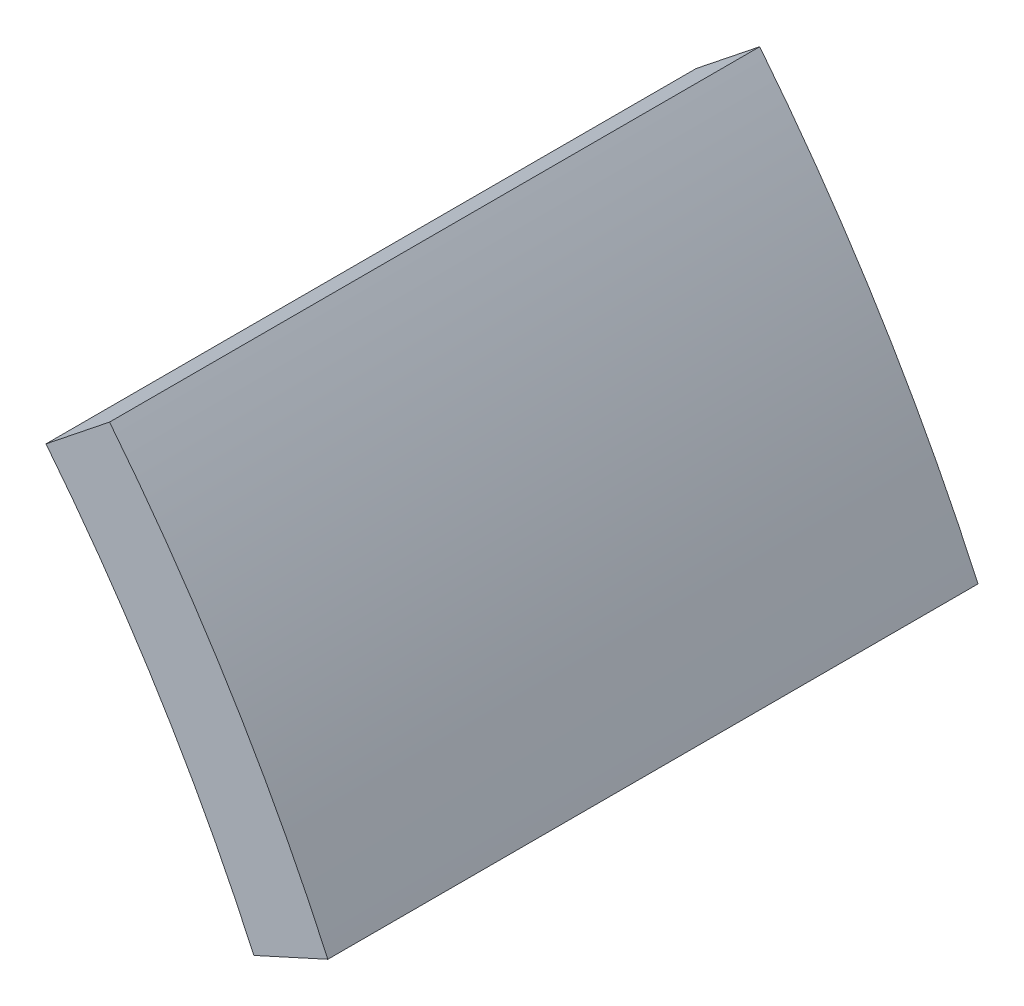
ISO-10303-21;
HEADER;
FILE_DESCRIPTION(('STEP AP214'),'2;1');
FILE_NAME('part.step','',(''),(''),'','','');
FILE_SCHEMA(('AUTOMOTIVE_DESIGN { 1 0 10303 214 1 1 1 1 }'));
ENDSEC;
DATA;
#1=APPLICATION_CONTEXT('core data for automotive mechanical design processes');
#2=APPLICATION_PROTOCOL_DEFINITION('international standard','automotive_design',2000,#1);
#3=PRODUCT_CONTEXT('',#1,'mechanical');
#4=PRODUCT('Part','Part','',(#3));
#5=PRODUCT_RELATED_PRODUCT_CATEGORY('part','',(#4));
#6=PRODUCT_DEFINITION_FORMATION('','',#4);
#7=PRODUCT_DEFINITION_CONTEXT('part definition',#1,'design');
#8=PRODUCT_DEFINITION('design','',#6,#7);
#9=PRODUCT_DEFINITION_SHAPE('','',#8);
#10=(LENGTH_UNIT() NAMED_UNIT(*) SI_UNIT(.MILLI.,.METRE.));
#11=(NAMED_UNIT(*) PLANE_ANGLE_UNIT() SI_UNIT($,.RADIAN.));
#12=(NAMED_UNIT(*) SI_UNIT($,.STERADIAN.) SOLID_ANGLE_UNIT());
#13=UNCERTAINTY_MEASURE_WITH_UNIT(LENGTH_MEASURE(1.E-05),#10,'distance_accuracy_value','');
#14=(GEOMETRIC_REPRESENTATION_CONTEXT(3) GLOBAL_UNCERTAINTY_ASSIGNED_CONTEXT((#13)) GLOBAL_UNIT_ASSIGNED_CONTEXT((#10,
#11,#12)) REPRESENTATION_CONTEXT('',''));
#15=CARTESIAN_POINT('',(0.,0.,0.));
#16=DIRECTION('',(0.,0.,1.));
#17=DIRECTION('',(1.,0.,0.));
#18=AXIS2_PLACEMENT_3D('',#15,#16,#17);
#19=CARTESIAN_POINT('',(-75.4909479660999,3.28970207192843,10.));
#20=DIRECTION('',(0.623312391087836,-0.781972929912772,0.));
#21=DIRECTION('',(0.,0.,-1.));
#22=AXIS2_PLACEMENT_3D('',#19,#20,#21);
#23=PLANE('',#22);
#24=DIRECTION('',(-0.781972929912772,-0.623312391087836,0.));
#25=VECTOR('',#24,1.);
#26=CARTESIAN_POINT('',(-75.4909479660999,3.28970207192842,-18.));
#27=LINE('',#26,#25);
#28=CARTESIAN_POINT('',(-2.27917339957138,61.6469731681758,-18.));
#29=VERTEX_POINT('',#28);
#30=CARTESIAN_POINT('',(-5.60255835169301,58.9978955060587,-18.));
#31=VERTEX_POINT('',#30);
#32=EDGE_CURVE('E11',#29,#31,#27,.T.);
#33=ORIENTED_EDGE('',*,*,#32,.T.);
#34=DIRECTION('',(0.,0.,-1.));
#35=VECTOR('',#34,1.);
#36=CARTESIAN_POINT('',(-5.60255835169301,58.9978955060587,10.));
#37=LINE('',#36,#35);
#38=CARTESIAN_POINT('',(-5.60255835169301,58.9978955060587,16.));
#39=VERTEX_POINT('',#38);
#40=EDGE_CURVE('E37',#39,#31,#37,.T.);
#41=ORIENTED_EDGE('',*,*,#40,.F.);
#42=DIRECTION('',(-0.781972929912772,-0.623312391087836,0.));
#43=VECTOR('',#42,1.);
#44=CARTESIAN_POINT('',(-75.4909479660999,3.28970207192842,16.));
#45=LINE('',#44,#43);
#46=CARTESIAN_POINT('',(-2.27917339957138,61.6469731681758,16.));
#47=VERTEX_POINT('',#46);
#48=EDGE_CURVE('E95',#47,#39,#45,.T.);
#49=ORIENTED_EDGE('',*,*,#48,.F.);
#50=DIRECTION('',(0.,0.,-1.));
#51=VECTOR('',#50,1.);
#52=CARTESIAN_POINT('',(-2.27917339957138,61.6469731681758,10.));
#53=LINE('',#52,#51);
#54=EDGE_CURVE('E28',#47,#29,#53,.T.);
#55=ORIENTED_EDGE('',*,*,#54,.T.);
#56=EDGE_LOOP('',(#33,#41,#49,#55));
#57=FACE_BOUND('',#56,.T.);
#58=ADVANCED_FACE('F17',(#57),#23,.F.);
#59=CARTESIAN_POINT('',(-71.8747641621128,6.17217036174182,10.));
#60=DIRECTION('',(0.,0.,-1.));
#61=DIRECTION('',(-1.,0.,0.));
#62=AXIS2_PLACEMENT_3D('',#59,#60,#61);
#63=CYLINDRICAL_SURFACE('',#62,88.9999999999993);
#64=CARTESIAN_POINT('',(-71.8747641621128,6.17217036174182,-18.));
#65=DIRECTION('',(0.,0.,1.));
#66=DIRECTION('',(-1.,0.,0.));
#67=AXIS2_PLACEMENT_3D('',#64,#65,#66);
#68=CIRCLE('',#67,88.9999999999993);
#69=CARTESIAN_POINT('',(9.13694292671469,43.0246236661543,-18.));
#70=VERTEX_POINT('',#69);
#71=EDGE_CURVE('E80',#70,#29,#68,.T.);
#72=ORIENTED_EDGE('',*,*,#71,.T.);
#73=ORIENTED_EDGE('',*,*,#54,.F.);
#74=CARTESIAN_POINT('',(-71.8747641621128,6.17217036174182,16.));
#75=DIRECTION('',(0.,0.,1.));
#76=DIRECTION('',(-1.,0.,0.));
#77=AXIS2_PLACEMENT_3D('',#74,#75,#76);
#78=CIRCLE('',#77,88.9999999999993);
#79=CARTESIAN_POINT('',(9.13694292671469,43.0246236661543,16.));
#80=VERTEX_POINT('',#79);
#81=EDGE_CURVE('E54',#80,#47,#78,.T.);
#82=ORIENTED_EDGE('',*,*,#81,.F.);
#83=DIRECTION('',(0.,0.,-1.));
#84=VECTOR('',#83,1.);
#85=CARTESIAN_POINT('',(9.13694292671469,43.0246236661543,10.));
#86=LINE('',#85,#84);
#87=EDGE_CURVE('E59',#80,#70,#86,.T.);
#88=ORIENTED_EDGE('',*,*,#87,.T.);
#89=EDGE_LOOP('',(#72,#73,#82,#88));
#90=FACE_BOUND('',#89,.T.);
#91=ADVANCED_FACE('F115',(#90),#63,.T.);
#92=CARTESIAN_POINT('',(-67.5425483112644,8.14290753118782,10.));
#93=DIRECTION('',(-0.414072509041721,0.910243899872937,0.));
#94=DIRECTION('',(0.,0.,1.));
#95=AXIS2_PLACEMENT_3D('',#92,#93,#94);
#96=PLANE('',#95);
#97=DIRECTION('',(0.910243899872937,0.414072509041721,0.));
#98=VECTOR('',#97,1.);
#99=CARTESIAN_POINT('',(-67.5425483112644,8.14290753118782,-18.));
#100=LINE('',#99,#98);
#101=CARTESIAN_POINT('',(5.26840635226366,41.2648155027311,-18.));
#102=VERTEX_POINT('',#101);
#103=EDGE_CURVE('E71',#102,#70,#100,.T.);
#104=ORIENTED_EDGE('',*,*,#103,.T.);
#105=ORIENTED_EDGE('',*,*,#87,.F.);
#106=DIRECTION('',(0.910243899872937,0.414072509041721,0.));
#107=VECTOR('',#106,1.);
#108=CARTESIAN_POINT('',(-67.5425483112644,8.14290753118782,16.));
#109=LINE('',#108,#107);
#110=CARTESIAN_POINT('',(5.26840635226366,41.2648155027311,16.));
#111=VERTEX_POINT('',#110);
#112=EDGE_CURVE('E65',#111,#80,#109,.T.);
#113=ORIENTED_EDGE('',*,*,#112,.F.);
#114=DIRECTION('',(0.,0.,-1.));
#115=VECTOR('',#114,1.);
#116=CARTESIAN_POINT('',(5.26840635226366,41.2648155027311,10.));
#117=LINE('',#116,#115);
#118=EDGE_CURVE('E68',#111,#102,#117,.T.);
#119=ORIENTED_EDGE('',*,*,#118,.T.);
#120=EDGE_LOOP('',(#104,#105,#113,#119));
#121=FACE_BOUND('',#120,.T.);
#122=ADVANCED_FACE('F70',(#121),#96,.F.);
#123=CARTESIAN_POINT('',(-71.8747641621128,6.17217036174182,10.));
#124=DIRECTION('',(0.,0.,-1.));
#125=DIRECTION('',(-1.,0.,0.));
#126=AXIS2_PLACEMENT_3D('',#123,#124,#125);
#127=CYLINDRICAL_SURFACE('',#126,84.7500000000091);
#128=CARTESIAN_POINT('',(-71.8747641621128,6.17217036174182,-18.));
#129=DIRECTION('',(0.,0.,1.));
#130=DIRECTION('',(-1.,0.,0.));
#131=AXIS2_PLACEMENT_3D('',#128,#129,#130);
#132=CIRCLE('',#131,84.7500000000091);
#133=EDGE_CURVE('E21',#102,#31,#132,.T.);
#134=ORIENTED_EDGE('',*,*,#133,.F.);
#135=ORIENTED_EDGE('',*,*,#118,.F.);
#136=CARTESIAN_POINT('',(-71.8747641621128,6.17217036174182,16.));
#137=DIRECTION('',(0.,0.,1.));
#138=DIRECTION('',(-1.,0.,0.));
#139=AXIS2_PLACEMENT_3D('',#136,#137,#138);
#140=CIRCLE('',#139,84.7500000000091);
#141=EDGE_CURVE('E74',#111,#39,#140,.T.);
#142=ORIENTED_EDGE('',*,*,#141,.T.);
#143=ORIENTED_EDGE('',*,*,#40,.T.);
#144=EDGE_LOOP('',(#134,#135,#142,#143));
#145=FACE_BOUND('',#144,.T.);
#146=ADVANCED_FACE('F19',(#145),#127,.F.);
#147=CARTESIAN_POINT('',(-51.833752333337,-26.38929492376,-18.));
#148=DIRECTION('',(0.,0.,1.));
#149=DIRECTION('',(1.,0.,0.));
#150=AXIS2_PLACEMENT_3D('',#147,#148,#149);
#151=PLANE('',#150);
#152=ORIENTED_EDGE('',*,*,#133,.T.);
#153=ORIENTED_EDGE('',*,*,#32,.F.);
#154=ORIENTED_EDGE('',*,*,#71,.F.);
#155=ORIENTED_EDGE('',*,*,#103,.F.);
#156=EDGE_LOOP('',(#152,#153,#154,#155));
#157=FACE_BOUND('',#156,.T.);
#158=ADVANCED_FACE('F78',(#157),#151,.F.);
#159=CARTESIAN_POINT('',(-51.833752333337,-26.38929492376,16.));
#160=DIRECTION('',(0.,0.,1.));
#161=DIRECTION('',(1.,0.,0.));
#162=AXIS2_PLACEMENT_3D('',#159,#160,#161);
#163=PLANE('',#162);
#164=ORIENTED_EDGE('',*,*,#141,.F.);
#165=ORIENTED_EDGE('',*,*,#112,.T.);
#166=ORIENTED_EDGE('',*,*,#81,.T.);
#167=ORIENTED_EDGE('',*,*,#48,.T.);
#168=EDGE_LOOP('',(#164,#165,#166,#167));
#169=FACE_BOUND('',#168,.T.);
#170=ADVANCED_FACE('F113',(#169),#163,.T.);
#171=CLOSED_SHELL('',(#58,#91,#122,#146,#158,#170));
#172=MANIFOLD_SOLID_BREP('B1',#171);
#173=ADVANCED_BREP_SHAPE_REPRESENTATION('',(#18,#172),#14);
#174=SHAPE_DEFINITION_REPRESENTATION(#9,#173);
ENDSEC;
END-ISO-10303-21;
